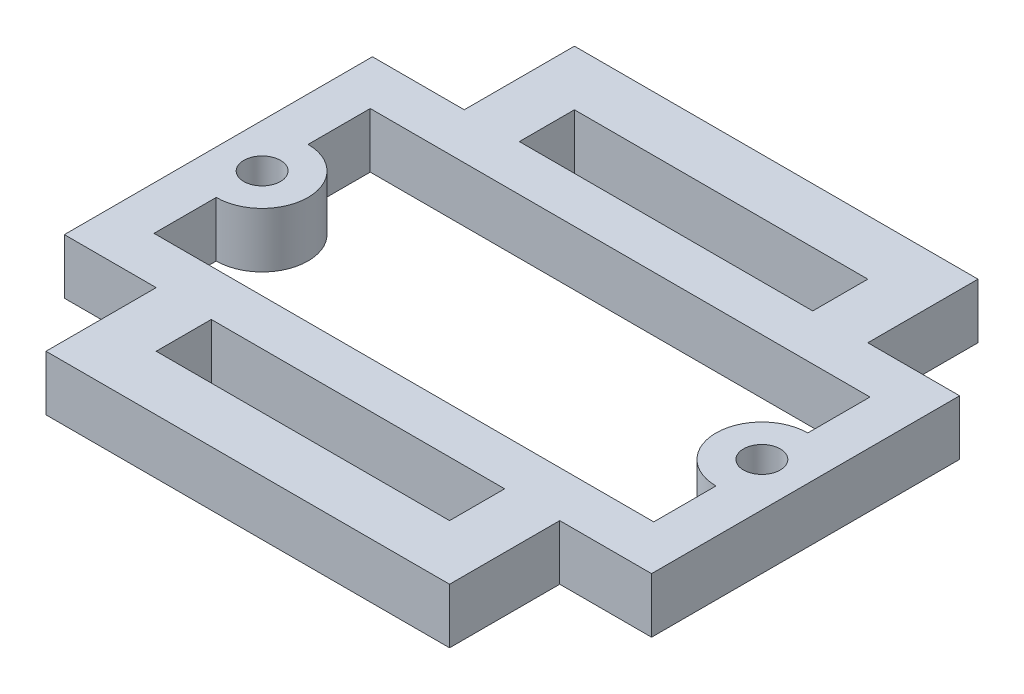
ISO-10303-21;
HEADER;
FILE_DESCRIPTION(('STEP AP214'),'2;1');
FILE_NAME('part.step','',(''),(''),'','','');
FILE_SCHEMA(('AUTOMOTIVE_DESIGN { 1 0 10303 214 1 1 1 1 }'));
ENDSEC;
DATA;
#1=APPLICATION_CONTEXT('core data for automotive mechanical design processes');
#2=APPLICATION_PROTOCOL_DEFINITION('international standard','automotive_design',2000,#1);
#3=PRODUCT_CONTEXT('',#1,'mechanical');
#4=PRODUCT('Part','Part','',(#3));
#5=PRODUCT_RELATED_PRODUCT_CATEGORY('part','',(#4));
#6=PRODUCT_DEFINITION_FORMATION('','',#4);
#7=PRODUCT_DEFINITION_CONTEXT('part definition',#1,'design');
#8=PRODUCT_DEFINITION('design','',#6,#7);
#9=PRODUCT_DEFINITION_SHAPE('','',#8);
#10=(LENGTH_UNIT() NAMED_UNIT(*) SI_UNIT(.MILLI.,.METRE.));
#11=(NAMED_UNIT(*) PLANE_ANGLE_UNIT() SI_UNIT($,.RADIAN.));
#12=(NAMED_UNIT(*) SI_UNIT($,.STERADIAN.) SOLID_ANGLE_UNIT());
#13=UNCERTAINTY_MEASURE_WITH_UNIT(LENGTH_MEASURE(1.E-05),#10,'distance_accuracy_value','');
#14=(GEOMETRIC_REPRESENTATION_CONTEXT(3) GLOBAL_UNCERTAINTY_ASSIGNED_CONTEXT((#13)) GLOBAL_UNIT_ASSIGNED_CONTEXT((#10,
#11,#12)) REPRESENTATION_CONTEXT('',''));
#15=CARTESIAN_POINT('',(0.,0.,0.));
#16=DIRECTION('',(0.,0.,1.));
#17=DIRECTION('',(1.,0.,0.));
#18=AXIS2_PLACEMENT_3D('',#15,#16,#17);
#19=CARTESIAN_POINT('',(30.06725,3.048,0.));
#20=DIRECTION('',(1.,0.,0.));
#21=DIRECTION('',(0.,0.,-1.));
#22=AXIS2_PLACEMENT_3D('',#19,#20,#21);
#23=PLANE('',#22);
#24=DIRECTION('',(0.,0.,1.));
#25=VECTOR('',#24,1.);
#26=CARTESIAN_POINT('',(30.06725,0.,0.));
#27=LINE('',#26,#25);
#28=CARTESIAN_POINT('',(30.06725,0.,2.54));
#29=VERTEX_POINT('',#28);
#30=CARTESIAN_POINT('',(30.06725,0.,5.98169999999999));
#31=VERTEX_POINT('',#30);
#32=EDGE_CURVE('E309',#29,#31,#27,.T.);
#33=ORIENTED_EDGE('',*,*,#32,.T.);
#34=DIRECTION('',(0.,-1.,0.));
#35=VECTOR('',#34,1.);
#36=CARTESIAN_POINT('',(30.06725,3.048,5.98169999999999));
#37=LINE('',#36,#35);
#38=CARTESIAN_POINT('',(30.06725,3.048,5.98169999999999));
#39=VERTEX_POINT('',#38);
#40=EDGE_CURVE('E11',#39,#31,#37,.T.);
#41=ORIENTED_EDGE('',*,*,#40,.F.);
#42=DIRECTION('',(0.,0.,1.));
#43=VECTOR('',#42,1.);
#44=CARTESIAN_POINT('',(30.06725,3.048,0.));
#45=LINE('',#44,#43);
#46=CARTESIAN_POINT('',(30.06725,3.048,2.54));
#47=VERTEX_POINT('',#46);
#48=EDGE_CURVE('E530',#47,#39,#45,.T.);
#49=ORIENTED_EDGE('',*,*,#48,.F.);
#50=DIRECTION('',(0.,-1.,0.));
#51=VECTOR('',#50,1.);
#52=CARTESIAN_POINT('',(30.06725,3.048,2.54));
#53=LINE('',#52,#51);
#54=EDGE_CURVE('E334',#47,#29,#53,.T.);
#55=ORIENTED_EDGE('',*,*,#54,.T.);
#56=EDGE_LOOP('',(#33,#41,#49,#55));
#57=FACE_BOUND('',#56,.T.);
#58=ADVANCED_FACE('F35',(#57),#23,.F.);
#59=CARTESIAN_POINT('',(0.,3.048,5.98169999999999));
#60=DIRECTION('',(0.,0.,-1.));
#61=DIRECTION('',(-1.,0.,0.));
#62=AXIS2_PLACEMENT_3D('',#59,#60,#61);
#63=PLANE('',#62);
#64=DIRECTION('',(1.,0.,0.));
#65=VECTOR('',#64,1.);
#66=CARTESIAN_POINT('',(0.,0.,5.98169999999999));
#67=LINE('',#66,#65);
#68=CARTESIAN_POINT('',(2.41935,0.,5.98169999999999));
#69=VERTEX_POINT('',#68);
#70=EDGE_CURVE('E312',#69,#31,#67,.T.);
#71=ORIENTED_EDGE('',*,*,#70,.F.);
#72=DIRECTION('',(0.,-1.,0.));
#73=VECTOR('',#72,1.);
#74=CARTESIAN_POINT('',(2.41935,3.048,5.98169999999999));
#75=LINE('',#74,#73);
#76=CARTESIAN_POINT('',(2.41935,3.048,5.98169999999999));
#77=VERTEX_POINT('',#76);
#78=EDGE_CURVE('E45',#77,#69,#75,.T.);
#79=ORIENTED_EDGE('',*,*,#78,.F.);
#80=DIRECTION('',(1.,0.,0.));
#81=VECTOR('',#80,1.);
#82=CARTESIAN_POINT('',(0.,3.048,5.98169999999999));
#83=LINE('',#82,#81);
#84=EDGE_CURVE('E525',#77,#39,#83,.T.);
#85=ORIENTED_EDGE('',*,*,#84,.T.);
#86=ORIENTED_EDGE('',*,*,#40,.T.);
#87=EDGE_LOOP('',(#71,#79,#85,#86));
#88=FACE_BOUND('',#87,.T.);
#89=ADVANCED_FACE('F418',(#88),#63,.T.);
#90=CARTESIAN_POINT('',(2.41935,3.048,0.));
#91=DIRECTION('',(1.,0.,0.));
#92=DIRECTION('',(0.,0.,-1.));
#93=AXIS2_PLACEMENT_3D('',#90,#91,#92);
#94=PLANE('',#93);
#95=DIRECTION('',(0.,0.,1.));
#96=VECTOR('',#95,1.);
#97=CARTESIAN_POINT('',(2.41935,0.,0.));
#98=LINE('',#97,#96);
#99=CARTESIAN_POINT('',(2.41935,0.,2.54));
#100=VERTEX_POINT('',#99);
#101=EDGE_CURVE('E315',#100,#69,#98,.T.);
#102=ORIENTED_EDGE('',*,*,#101,.F.);
#103=DIRECTION('',(0.,-1.,0.));
#104=VECTOR('',#103,1.);
#105=CARTESIAN_POINT('',(2.41935,3.048,2.54));
#106=LINE('',#105,#104);
#107=CARTESIAN_POINT('',(2.41935,3.048,2.54));
#108=VERTEX_POINT('',#107);
#109=EDGE_CURVE('E341',#108,#100,#106,.T.);
#110=ORIENTED_EDGE('',*,*,#109,.F.);
#111=DIRECTION('',(0.,0.,1.));
#112=VECTOR('',#111,1.);
#113=CARTESIAN_POINT('',(2.41935,3.048,0.));
#114=LINE('',#113,#112);
#115=EDGE_CURVE('E523',#108,#77,#114,.T.);
#116=ORIENTED_EDGE('',*,*,#115,.T.);
#117=ORIENTED_EDGE('',*,*,#78,.T.);
#118=EDGE_LOOP('',(#102,#110,#116,#117));
#119=FACE_BOUND('',#118,.T.);
#120=ADVANCED_FACE('F424',(#119),#94,.T.);
#121=CARTESIAN_POINT('',(2.41935,3.048,0.));
#122=DIRECTION('',(0.,-1.,0.));
#123=DIRECTION('',(0.,0.,-1.));
#124=AXIS2_PLACEMENT_3D('',#121,#122,#123);
#125=CYLINDRICAL_SURFACE('',#124,2.54);
#126=CARTESIAN_POINT('',(2.41935,0.,0.));
#127=DIRECTION('',(0.,1.,0.));
#128=DIRECTION('',(0.,0.,1.));
#129=AXIS2_PLACEMENT_3D('',#126,#127,#128);
#130=CIRCLE('',#129,2.54);
#131=CARTESIAN_POINT('',(2.41935,0.,-2.54));
#132=VERTEX_POINT('',#131);
#133=EDGE_CURVE('E318',#132,#100,#130,.F.);
#134=ORIENTED_EDGE('',*,*,#133,.F.);
#135=DIRECTION('',(0.,-1.,0.));
#136=VECTOR('',#135,1.);
#137=CARTESIAN_POINT('',(2.41935,3.048,-2.54));
#138=LINE('',#137,#136);
#139=CARTESIAN_POINT('',(2.41935,3.048,-2.54));
#140=VERTEX_POINT('',#139);
#141=EDGE_CURVE('E339',#140,#132,#138,.T.);
#142=ORIENTED_EDGE('',*,*,#141,.F.);
#143=CARTESIAN_POINT('',(2.41935,3.048,0.));
#144=DIRECTION('',(0.,1.,0.));
#145=DIRECTION('',(0.,0.,1.));
#146=AXIS2_PLACEMENT_3D('',#143,#144,#145);
#147=CIRCLE('',#146,2.54);
#148=EDGE_CURVE('E522',#140,#108,#147,.F.);
#149=ORIENTED_EDGE('',*,*,#148,.T.);
#150=ORIENTED_EDGE('',*,*,#109,.T.);
#151=EDGE_LOOP('',(#134,#142,#149,#150));
#152=FACE_BOUND('',#151,.T.);
#153=ADVANCED_FACE('F504',(#152),#125,.T.);
#154=CARTESIAN_POINT('',(2.41935,3.048,0.));
#155=DIRECTION('',(-1.,0.,0.));
#156=DIRECTION('',(0.,0.,1.));
#157=AXIS2_PLACEMENT_3D('',#154,#155,#156);
#158=PLANE('',#157);
#159=DIRECTION('',(0.,0.,-1.));
#160=VECTOR('',#159,1.);
#161=CARTESIAN_POINT('',(2.41935,0.,0.));
#162=LINE('',#161,#160);
#163=CARTESIAN_POINT('',(2.41935,0.,-5.98169999999999));
#164=VERTEX_POINT('',#163);
#165=EDGE_CURVE('E321',#132,#164,#162,.T.);
#166=ORIENTED_EDGE('',*,*,#165,.T.);
#167=DIRECTION('',(0.,-1.,0.));
#168=VECTOR('',#167,1.);
#169=CARTESIAN_POINT('',(2.41935,3.048,-5.98169999999999));
#170=LINE('',#169,#168);
#171=CARTESIAN_POINT('',(2.41935,3.048,-5.98169999999999));
#172=VERTEX_POINT('',#171);
#173=EDGE_CURVE('E246',#172,#164,#170,.T.);
#174=ORIENTED_EDGE('',*,*,#173,.F.);
#175=DIRECTION('',(0.,0.,-1.));
#176=VECTOR('',#175,1.);
#177=CARTESIAN_POINT('',(2.41935,3.048,0.));
#178=LINE('',#177,#176);
#179=EDGE_CURVE('E233',#140,#172,#178,.T.);
#180=ORIENTED_EDGE('',*,*,#179,.F.);
#181=ORIENTED_EDGE('',*,*,#141,.T.);
#182=EDGE_LOOP('',(#166,#174,#180,#181));
#183=FACE_BOUND('',#182,.T.);
#184=ADVANCED_FACE('F501',(#183),#158,.F.);
#185=CARTESIAN_POINT('',(0.,3.048,-5.98169999999999));
#186=DIRECTION('',(0.,0.,-1.));
#187=DIRECTION('',(-1.,0.,0.));
#188=AXIS2_PLACEMENT_3D('',#185,#186,#187);
#189=PLANE('',#188);
#190=DIRECTION('',(1.,0.,0.));
#191=VECTOR('',#190,1.);
#192=CARTESIAN_POINT('',(0.,0.,-5.98169999999999));
#193=LINE('',#192,#191);
#194=CARTESIAN_POINT('',(30.06725,0.,-5.98170000000001));
#195=VERTEX_POINT('',#194);
#196=EDGE_CURVE('E242',#164,#195,#193,.T.);
#197=ORIENTED_EDGE('',*,*,#196,.T.);
#198=DIRECTION('',(0.,-1.,0.));
#199=VECTOR('',#198,1.);
#200=CARTESIAN_POINT('',(30.06725,3.048,-5.98170000000001));
#201=LINE('',#200,#199);
#202=CARTESIAN_POINT('',(30.06725,3.048,-5.98170000000001));
#203=VERTEX_POINT('',#202);
#204=EDGE_CURVE('E239',#203,#195,#201,.T.);
#205=ORIENTED_EDGE('',*,*,#204,.F.);
#206=DIRECTION('',(1.,0.,0.));
#207=VECTOR('',#206,1.);
#208=CARTESIAN_POINT('',(0.,3.048,-5.98169999999999));
#209=LINE('',#208,#207);
#210=EDGE_CURVE('E225',#172,#203,#209,.T.);
#211=ORIENTED_EDGE('',*,*,#210,.F.);
#212=ORIENTED_EDGE('',*,*,#173,.T.);
#213=EDGE_LOOP('',(#197,#205,#211,#212));
#214=FACE_BOUND('',#213,.T.);
#215=ADVANCED_FACE('F240',(#214),#189,.F.);
#216=CARTESIAN_POINT('',(30.06725,3.048,0.));
#217=DIRECTION('',(-1.,0.,0.));
#218=DIRECTION('',(0.,0.,1.));
#219=AXIS2_PLACEMENT_3D('',#216,#217,#218);
#220=PLANE('',#219);
#221=DIRECTION('',(0.,0.,-1.));
#222=VECTOR('',#221,1.);
#223=CARTESIAN_POINT('',(30.06725,0.,0.));
#224=LINE('',#223,#222);
#225=CARTESIAN_POINT('',(30.06725,0.,-2.54));
#226=VERTEX_POINT('',#225);
#227=EDGE_CURVE('E324',#226,#195,#224,.T.);
#228=ORIENTED_EDGE('',*,*,#227,.F.);
#229=DIRECTION('',(0.,-1.,0.));
#230=VECTOR('',#229,1.);
#231=CARTESIAN_POINT('',(30.06725,3.048,-2.54));
#232=LINE('',#231,#230);
#233=CARTESIAN_POINT('',(30.06725,3.048,-2.54));
#234=VERTEX_POINT('',#233);
#235=EDGE_CURVE('E141',#234,#226,#232,.T.);
#236=ORIENTED_EDGE('',*,*,#235,.F.);
#237=DIRECTION('',(0.,0.,-1.));
#238=VECTOR('',#237,1.);
#239=CARTESIAN_POINT('',(30.06725,3.048,0.));
#240=LINE('',#239,#238);
#241=EDGE_CURVE('E230',#234,#203,#240,.T.);
#242=ORIENTED_EDGE('',*,*,#241,.T.);
#243=ORIENTED_EDGE('',*,*,#204,.T.);
#244=EDGE_LOOP('',(#228,#236,#242,#243));
#245=FACE_BOUND('',#244,.T.);
#246=ADVANCED_FACE('F248',(#245),#220,.T.);
#247=CARTESIAN_POINT('',(0.,3.048,-8.52169999999999));
#248=DIRECTION('',(0.,0.,-1.));
#249=DIRECTION('',(-1.,0.,0.));
#250=AXIS2_PLACEMENT_3D('',#247,#248,#249);
#251=PLANE('',#250);
#252=DIRECTION('',(1.,0.,0.));
#253=VECTOR('',#252,1.);
#254=CARTESIAN_POINT('',(0.,0.,-8.52169999999999));
#255=LINE('',#254,#253);
#256=CARTESIAN_POINT('',(8.128,0.,-8.52169999999999));
#257=VERTEX_POINT('',#256);
#258=CARTESIAN_POINT('',(24.3586,0.,-8.52169999999999));
#259=VERTEX_POINT('',#258);
#260=EDGE_CURVE('E281',#257,#259,#255,.T.);
#261=ORIENTED_EDGE('',*,*,#260,.F.);
#262=DIRECTION('',(0.,-1.,0.));
#263=VECTOR('',#262,1.);
#264=CARTESIAN_POINT('',(8.128,3.048,-8.52169999999999));
#265=LINE('',#264,#263);
#266=CARTESIAN_POINT('',(8.128,3.048,-8.52169999999999));
#267=VERTEX_POINT('',#266);
#268=EDGE_CURVE('E336',#267,#257,#265,.T.);
#269=ORIENTED_EDGE('',*,*,#268,.F.);
#270=DIRECTION('',(1.,0.,0.));
#271=VECTOR('',#270,1.);
#272=CARTESIAN_POINT('',(0.,3.048,-8.52169999999999));
#273=LINE('',#272,#271);
#274=CARTESIAN_POINT('',(24.3586,3.048,-8.52169999999999));
#275=VERTEX_POINT('',#274);
#276=EDGE_CURVE('E540',#267,#275,#273,.T.);
#277=ORIENTED_EDGE('',*,*,#276,.T.);
#278=DIRECTION('',(0.,-1.,0.));
#279=VECTOR('',#278,1.);
#280=CARTESIAN_POINT('',(24.3586,3.048,-8.52169999999999));
#281=LINE('',#280,#279);
#282=EDGE_CURVE('E344',#275,#259,#281,.T.);
#283=ORIENTED_EDGE('',*,*,#282,.T.);
#284=EDGE_LOOP('',(#261,#269,#277,#283));
#285=FACE_BOUND('',#284,.T.);
#286=ADVANCED_FACE('F441',(#285),#251,.T.);
#287=CARTESIAN_POINT('',(8.128,3.048,0.));
#288=DIRECTION('',(-1.,0.,0.));
#289=DIRECTION('',(0.,0.,1.));
#290=AXIS2_PLACEMENT_3D('',#287,#288,#289);
#291=PLANE('',#290);
#292=DIRECTION('',(0.,0.,-1.));
#293=VECTOR('',#292,1.);
#294=CARTESIAN_POINT('',(8.128,0.,0.));
#295=LINE('',#294,#293);
#296=CARTESIAN_POINT('',(8.128,0.,-11.5697));
#297=VERTEX_POINT('',#296);
#298=EDGE_CURVE('E300',#257,#297,#295,.T.);
#299=ORIENTED_EDGE('',*,*,#298,.T.);
#300=DIRECTION('',(0.,-1.,0.));
#301=VECTOR('',#300,1.);
#302=CARTESIAN_POINT('',(8.128,3.048,-11.5697));
#303=LINE('',#302,#301);
#304=CARTESIAN_POINT('',(8.128,3.048,-11.5697));
#305=VERTEX_POINT('',#304);
#306=EDGE_CURVE('E350',#305,#297,#303,.T.);
#307=ORIENTED_EDGE('',*,*,#306,.F.);
#308=DIRECTION('',(0.,0.,-1.));
#309=VECTOR('',#308,1.);
#310=CARTESIAN_POINT('',(8.128,3.048,0.));
#311=LINE('',#310,#309);
#312=EDGE_CURVE('E537',#267,#305,#311,.T.);
#313=ORIENTED_EDGE('',*,*,#312,.F.);
#314=ORIENTED_EDGE('',*,*,#268,.T.);
#315=EDGE_LOOP('',(#299,#307,#313,#314));
#316=FACE_BOUND('',#315,.T.);
#317=ADVANCED_FACE('F437',(#316),#291,.F.);
#318=CARTESIAN_POINT('',(0.,3.048,-11.5697));
#319=DIRECTION('',(0.,0.,-1.));
#320=DIRECTION('',(-1.,0.,0.));
#321=AXIS2_PLACEMENT_3D('',#318,#319,#320);
#322=PLANE('',#321);
#323=DIRECTION('',(1.,0.,0.));
#324=VECTOR('',#323,1.);
#325=CARTESIAN_POINT('',(0.,0.,-11.5697));
#326=LINE('',#325,#324);
#327=CARTESIAN_POINT('',(24.3586,0.,-11.5697));
#328=VERTEX_POINT('',#327);
#329=EDGE_CURVE('E303',#297,#328,#326,.T.);
#330=ORIENTED_EDGE('',*,*,#329,.T.);
#331=DIRECTION('',(0.,-1.,0.));
#332=VECTOR('',#331,1.);
#333=CARTESIAN_POINT('',(24.3586,3.048,-11.5697));
#334=LINE('',#333,#332);
#335=CARTESIAN_POINT('',(24.3586,3.048,-11.5697));
#336=VERTEX_POINT('',#335);
#337=EDGE_CURVE('E346',#336,#328,#334,.T.);
#338=ORIENTED_EDGE('',*,*,#337,.F.);
#339=DIRECTION('',(1.,0.,0.));
#340=VECTOR('',#339,1.);
#341=CARTESIAN_POINT('',(0.,3.048,-11.5697));
#342=LINE('',#341,#340);
#343=EDGE_CURVE('E534',#305,#336,#342,.T.);
#344=ORIENTED_EDGE('',*,*,#343,.F.);
#345=ORIENTED_EDGE('',*,*,#306,.T.);
#346=EDGE_LOOP('',(#330,#338,#344,#345));
#347=FACE_BOUND('',#346,.T.);
#348=ADVANCED_FACE('F434',(#347),#322,.F.);
#349=CARTESIAN_POINT('',(0.,3.048,8.52169999999999));
#350=DIRECTION('',(0.,0.,-1.));
#351=DIRECTION('',(-1.,0.,0.));
#352=AXIS2_PLACEMENT_3D('',#349,#350,#351);
#353=PLANE('',#352);
#354=DIRECTION('',(1.,0.,0.));
#355=VECTOR('',#354,1.);
#356=CARTESIAN_POINT('',(0.,0.,8.52169999999999));
#357=LINE('',#356,#355);
#358=CARTESIAN_POINT('',(27.4066,0.,8.52169999999999));
#359=VERTEX_POINT('',#358);
#360=CARTESIAN_POINT('',(32.4866,0.,8.52169999999999));
#361=VERTEX_POINT('',#360);
#362=EDGE_CURVE('E268',#359,#361,#357,.T.);
#363=ORIENTED_EDGE('',*,*,#362,.T.);
#364=DIRECTION('',(0.,-1.,0.));
#365=VECTOR('',#364,1.);
#366=CARTESIAN_POINT('',(32.4866,3.048,8.52169999999999));
#367=LINE('',#366,#365);
#368=CARTESIAN_POINT('',(32.4866,3.048,8.52169999999999));
#369=VERTEX_POINT('',#368);
#370=EDGE_CURVE('E347',#369,#361,#367,.T.);
#371=ORIENTED_EDGE('',*,*,#370,.F.);
#372=DIRECTION('',(1.,0.,0.));
#373=VECTOR('',#372,1.);
#374=CARTESIAN_POINT('',(0.,3.048,8.52169999999999));
#375=LINE('',#374,#373);
#376=CARTESIAN_POINT('',(27.4066,3.048,8.52169999999999));
#377=VERTEX_POINT('',#376);
#378=EDGE_CURVE('E567',#377,#369,#375,.T.);
#379=ORIENTED_EDGE('',*,*,#378,.F.);
#380=DIRECTION('',(0.,-1.,0.));
#381=VECTOR('',#380,1.);
#382=CARTESIAN_POINT('',(27.4066,3.048,8.52169999999999));
#383=LINE('',#382,#381);
#384=EDGE_CURVE('E354',#377,#359,#383,.T.);
#385=ORIENTED_EDGE('',*,*,#384,.T.);
#386=EDGE_LOOP('',(#363,#371,#379,#385));
#387=FACE_BOUND('',#386,.T.);
#388=ADVANCED_FACE('F414',(#387),#353,.F.);
#389=CARTESIAN_POINT('',(32.4866,3.048,0.));
#390=DIRECTION('',(1.,0.,0.));
#391=DIRECTION('',(0.,0.,-1.));
#392=AXIS2_PLACEMENT_3D('',#389,#390,#391);
#393=PLANE('',#392);
#394=DIRECTION('',(0.,0.,1.));
#395=VECTOR('',#394,1.);
#396=CARTESIAN_POINT('',(32.4866,0.,0.));
#397=LINE('',#396,#395);
#398=CARTESIAN_POINT('',(32.4866,0.,-8.52169999999999));
#399=VERTEX_POINT('',#398);
#400=EDGE_CURVE('E274',#399,#361,#397,.T.);
#401=ORIENTED_EDGE('',*,*,#400,.F.);
#402=DIRECTION('',(0.,-1.,0.));
#403=VECTOR('',#402,1.);
#404=CARTESIAN_POINT('',(32.4866,3.048,-8.52169999999999));
#405=LINE('',#404,#403);
#406=CARTESIAN_POINT('',(32.4866,3.048,-8.52169999999999));
#407=VERTEX_POINT('',#406);
#408=EDGE_CURVE('E378',#407,#399,#405,.T.);
#409=ORIENTED_EDGE('',*,*,#408,.F.);
#410=DIRECTION('',(0.,0.,1.));
#411=VECTOR('',#410,1.);
#412=CARTESIAN_POINT('',(32.4866,3.048,0.));
#413=LINE('',#412,#411);
#414=EDGE_CURVE('E564',#407,#369,#413,.T.);
#415=ORIENTED_EDGE('',*,*,#414,.T.);
#416=ORIENTED_EDGE('',*,*,#370,.T.);
#417=EDGE_LOOP('',(#401,#409,#415,#416));
#418=FACE_BOUND('',#417,.T.);
#419=ADVANCED_FACE('F477',(#418),#393,.T.);
#420=CARTESIAN_POINT('',(27.4066,0.,-8.52169999999999));
#421=VERTEX_POINT('',#420);
#422=EDGE_CURVE('E277',#421,#399,#255,.T.);
#423=ORIENTED_EDGE('',*,*,#422,.F.);
#424=DIRECTION('',(0.,-1.,0.));
#425=VECTOR('',#424,1.);
#426=CARTESIAN_POINT('',(27.4066,3.048,-8.52169999999999));
#427=LINE('',#426,#425);
#428=CARTESIAN_POINT('',(27.4066,3.048,-8.52169999999999));
#429=VERTEX_POINT('',#428);
#430=EDGE_CURVE('E376',#429,#421,#427,.T.);
#431=ORIENTED_EDGE('',*,*,#430,.F.);
#432=EDGE_CURVE('E561',#429,#407,#273,.T.);
#433=ORIENTED_EDGE('',*,*,#432,.T.);
#434=ORIENTED_EDGE('',*,*,#408,.T.);
#435=EDGE_LOOP('',(#423,#431,#433,#434));
#436=FACE_BOUND('',#435,.T.);
#437=ADVANCED_FACE('F446',(#436),#251,.T.);
#438=CARTESIAN_POINT('',(27.4066,3.048,0.));
#439=DIRECTION('',(1.,0.,0.));
#440=DIRECTION('',(0.,0.,-1.));
#441=AXIS2_PLACEMENT_3D('',#438,#439,#440);
#442=PLANE('',#441);
#443=DIRECTION('',(0.,0.,1.));
#444=VECTOR('',#443,1.);
#445=CARTESIAN_POINT('',(27.4066,0.,0.));
#446=LINE('',#445,#444);
#447=CARTESIAN_POINT('',(27.4066,0.,-14.6177));
#448=VERTEX_POINT('',#447);
#449=EDGE_CURVE('E280',#448,#421,#446,.T.);
#450=ORIENTED_EDGE('',*,*,#449,.F.);
#451=DIRECTION('',(0.,-1.,0.));
#452=VECTOR('',#451,1.);
#453=CARTESIAN_POINT('',(27.4066,3.048,-14.6177));
#454=LINE('',#453,#452);
#455=CARTESIAN_POINT('',(27.4066,3.048,-14.6177));
#456=VERTEX_POINT('',#455);
#457=EDGE_CURVE('E374',#456,#448,#454,.T.);
#458=ORIENTED_EDGE('',*,*,#457,.F.);
#459=DIRECTION('',(0.,0.,1.));
#460=VECTOR('',#459,1.);
#461=CARTESIAN_POINT('',(27.4066,3.048,0.));
#462=LINE('',#461,#460);
#463=EDGE_CURVE('E558',#456,#429,#462,.T.);
#464=ORIENTED_EDGE('',*,*,#463,.T.);
#465=ORIENTED_EDGE('',*,*,#430,.T.);
#466=EDGE_LOOP('',(#450,#458,#464,#465));
#467=FACE_BOUND('',#466,.T.);
#468=ADVANCED_FACE('F472',(#467),#442,.T.);
#469=CARTESIAN_POINT('',(0.,3.048,-14.6177));
#470=DIRECTION('',(0.,0.,-1.));
#471=DIRECTION('',(-1.,0.,0.));
#472=AXIS2_PLACEMENT_3D('',#469,#470,#471);
#473=PLANE('',#472);
#474=DIRECTION('',(1.,0.,0.));
#475=VECTOR('',#474,1.);
#476=CARTESIAN_POINT('',(0.,0.,-14.6177));
#477=LINE('',#476,#475);
#478=CARTESIAN_POINT('',(5.08,0.,-14.6177));
#479=VERTEX_POINT('',#478);
#480=EDGE_CURVE('E285',#479,#448,#477,.T.);
#481=ORIENTED_EDGE('',*,*,#480,.F.);
#482=DIRECTION('',(0.,-1.,0.));
#483=VECTOR('',#482,1.);
#484=CARTESIAN_POINT('',(5.08,3.048,-14.6177));
#485=LINE('',#484,#483);
#486=CARTESIAN_POINT('',(5.08,3.048,-14.6177));
#487=VERTEX_POINT('',#486);
#488=EDGE_CURVE('E372',#487,#479,#485,.T.);
#489=ORIENTED_EDGE('',*,*,#488,.F.);
#490=DIRECTION('',(1.,0.,0.));
#491=VECTOR('',#490,1.);
#492=CARTESIAN_POINT('',(0.,3.048,-14.6177));
#493=LINE('',#492,#491);
#494=EDGE_CURVE('E555',#487,#456,#493,.T.);
#495=ORIENTED_EDGE('',*,*,#494,.T.);
#496=ORIENTED_EDGE('',*,*,#457,.T.);
#497=EDGE_LOOP('',(#481,#489,#495,#496));
#498=FACE_BOUND('',#497,.T.);
#499=ADVANCED_FACE('F468',(#498),#473,.T.);
#500=CARTESIAN_POINT('',(5.08,3.048,0.));
#501=DIRECTION('',(-1.,0.,0.));
#502=DIRECTION('',(0.,0.,1.));
#503=AXIS2_PLACEMENT_3D('',#500,#501,#502);
#504=PLANE('',#503);
#505=DIRECTION('',(0.,0.,-1.));
#506=VECTOR('',#505,1.);
#507=CARTESIAN_POINT('',(5.08,0.,0.));
#508=LINE('',#507,#506);
#509=CARTESIAN_POINT('',(5.08,0.,-8.52169999999999));
#510=VERTEX_POINT('',#509);
#511=EDGE_CURVE('E288',#510,#479,#508,.T.);
#512=ORIENTED_EDGE('',*,*,#511,.F.);
#513=DIRECTION('',(0.,-1.,0.));
#514=VECTOR('',#513,1.);
#515=CARTESIAN_POINT('',(5.08,3.048,-8.52169999999999));
#516=LINE('',#515,#514);
#517=CARTESIAN_POINT('',(5.08,3.048,-8.52169999999999));
#518=VERTEX_POINT('',#517);
#519=EDGE_CURVE('E370',#518,#510,#516,.T.);
#520=ORIENTED_EDGE('',*,*,#519,.F.);
#521=DIRECTION('',(0.,0.,-1.));
#522=VECTOR('',#521,1.);
#523=CARTESIAN_POINT('',(5.08,3.048,0.));
#524=LINE('',#523,#522);
#525=EDGE_CURVE('E552',#518,#487,#524,.T.);
#526=ORIENTED_EDGE('',*,*,#525,.T.);
#527=ORIENTED_EDGE('',*,*,#488,.T.);
#528=EDGE_LOOP('',(#512,#520,#526,#527));
#529=FACE_BOUND('',#528,.T.);
#530=ADVANCED_FACE('F465',(#529),#504,.T.);
#531=CARTESIAN_POINT('',(0.,0.,-8.52169999999999));
#532=VERTEX_POINT('',#531);
#533=EDGE_CURVE('E282',#532,#510,#255,.T.);
#534=ORIENTED_EDGE('',*,*,#533,.F.);
#535=DIRECTION('',(0.,-1.,0.));
#536=VECTOR('',#535,1.);
#537=CARTESIAN_POINT('',(0.,3.048,-8.52169999999999));
#538=LINE('',#537,#536);
#539=CARTESIAN_POINT('',(0.,3.048,-8.52169999999999));
#540=VERTEX_POINT('',#539);
#541=EDGE_CURVE('E368',#540,#532,#538,.T.);
#542=ORIENTED_EDGE('',*,*,#541,.F.);
#543=EDGE_CURVE('E551',#540,#518,#273,.T.);
#544=ORIENTED_EDGE('',*,*,#543,.T.);
#545=ORIENTED_EDGE('',*,*,#519,.T.);
#546=EDGE_LOOP('',(#534,#542,#544,#545));
#547=FACE_BOUND('',#546,.T.);
#548=ADVANCED_FACE('F447',(#547),#251,.T.);
#549=CARTESIAN_POINT('',(0.,3.048,0.));
#550=DIRECTION('',(-1.,0.,0.));
#551=DIRECTION('',(0.,0.,1.));
#552=AXIS2_PLACEMENT_3D('',#549,#550,#551);
#553=PLANE('',#552);
#554=DIRECTION('',(0.,0.,-1.));
#555=VECTOR('',#554,1.);
#556=CARTESIAN_POINT('',(0.,0.,0.));
#557=LINE('',#556,#555);
#558=CARTESIAN_POINT('',(0.,0.,8.52169999999999));
#559=VERTEX_POINT('',#558);
#560=EDGE_CURVE('E291',#559,#532,#557,.T.);
#561=ORIENTED_EDGE('',*,*,#560,.F.);
#562=DIRECTION('',(0.,-1.,0.));
#563=VECTOR('',#562,1.);
#564=CARTESIAN_POINT('',(0.,3.048,8.52169999999999));
#565=LINE('',#564,#563);
#566=CARTESIAN_POINT('',(0.,3.048,8.52169999999999));
#567=VERTEX_POINT('',#566);
#568=EDGE_CURVE('E366',#567,#559,#565,.T.);
#569=ORIENTED_EDGE('',*,*,#568,.F.);
#570=DIRECTION('',(0.,0.,-1.));
#571=VECTOR('',#570,1.);
#572=CARTESIAN_POINT('',(0.,3.048,0.));
#573=LINE('',#572,#571);
#574=EDGE_CURVE('E548',#567,#540,#573,.T.);
#575=ORIENTED_EDGE('',*,*,#574,.T.);
#576=ORIENTED_EDGE('',*,*,#541,.T.);
#577=EDGE_LOOP('',(#561,#569,#575,#576));
#578=FACE_BOUND('',#577,.T.);
#579=ADVANCED_FACE('F460',(#578),#553,.T.);
#580=CARTESIAN_POINT('',(5.08,0.,8.52169999999999));
#581=VERTEX_POINT('',#580);
#582=EDGE_CURVE('E267',#559,#581,#357,.T.);
#583=ORIENTED_EDGE('',*,*,#582,.T.);
#584=DIRECTION('',(0.,-1.,0.));
#585=VECTOR('',#584,1.);
#586=CARTESIAN_POINT('',(5.08,3.048,8.52169999999999));
#587=LINE('',#586,#585);
#588=CARTESIAN_POINT('',(5.08,3.048,8.52169999999999));
#589=VERTEX_POINT('',#588);
#590=EDGE_CURVE('E363',#589,#581,#587,.T.);
#591=ORIENTED_EDGE('',*,*,#590,.F.);
#592=EDGE_CURVE('E547',#567,#589,#375,.T.);
#593=ORIENTED_EDGE('',*,*,#592,.F.);
#594=ORIENTED_EDGE('',*,*,#568,.T.);
#595=EDGE_LOOP('',(#583,#591,#593,#594));
#596=FACE_BOUND('',#595,.T.);
#597=ADVANCED_FACE('F415',(#596),#353,.F.);
#598=CARTESIAN_POINT('',(5.08,3.048,0.));
#599=DIRECTION('',(1.,0.,0.));
#600=DIRECTION('',(0.,0.,-1.));
#601=AXIS2_PLACEMENT_3D('',#598,#599,#600);
#602=PLANE('',#601);
#603=DIRECTION('',(0.,0.,1.));
#604=VECTOR('',#603,1.);
#605=CARTESIAN_POINT('',(5.08,0.,0.));
#606=LINE('',#605,#604);
#607=CARTESIAN_POINT('',(5.08,0.,14.6177));
#608=VERTEX_POINT('',#607);
#609=EDGE_CURVE('E294',#581,#608,#606,.T.);
#610=ORIENTED_EDGE('',*,*,#609,.T.);
#611=DIRECTION('',(0.,-1.,0.));
#612=VECTOR('',#611,1.);
#613=CARTESIAN_POINT('',(5.08,3.048,14.6177));
#614=LINE('',#613,#612);
#615=CARTESIAN_POINT('',(5.08,3.048,14.6177));
#616=VERTEX_POINT('',#615);
#617=EDGE_CURVE('E360',#616,#608,#614,.T.);
#618=ORIENTED_EDGE('',*,*,#617,.F.);
#619=DIRECTION('',(0.,0.,1.));
#620=VECTOR('',#619,1.);
#621=CARTESIAN_POINT('',(5.08,3.048,0.));
#622=LINE('',#621,#620);
#623=EDGE_CURVE('E545',#589,#616,#622,.T.);
#624=ORIENTED_EDGE('',*,*,#623,.F.);
#625=ORIENTED_EDGE('',*,*,#590,.T.);
#626=EDGE_LOOP('',(#610,#618,#624,#625));
#627=FACE_BOUND('',#626,.T.);
#628=ADVANCED_FACE('F454',(#627),#602,.F.);
#629=CARTESIAN_POINT('',(0.,3.048,14.6177));
#630=DIRECTION('',(0.,0.,-1.));
#631=DIRECTION('',(-1.,0.,0.));
#632=AXIS2_PLACEMENT_3D('',#629,#630,#631);
#633=PLANE('',#632);
#634=DIRECTION('',(1.,0.,0.));
#635=VECTOR('',#634,1.);
#636=CARTESIAN_POINT('',(0.,0.,14.6177));
#637=LINE('',#636,#635);
#638=CARTESIAN_POINT('',(27.4066,0.,14.6177));
#639=VERTEX_POINT('',#638);
#640=EDGE_CURVE('E296',#608,#639,#637,.T.);
#641=ORIENTED_EDGE('',*,*,#640,.T.);
#642=DIRECTION('',(0.,-1.,0.));
#643=VECTOR('',#642,1.);
#644=CARTESIAN_POINT('',(27.4066,3.048,14.6177));
#645=LINE('',#644,#643);
#646=CARTESIAN_POINT('',(27.4066,3.048,14.6177));
#647=VERTEX_POINT('',#646);
#648=EDGE_CURVE('E357',#647,#639,#645,.T.);
#649=ORIENTED_EDGE('',*,*,#648,.F.);
#650=DIRECTION('',(1.,0.,0.));
#651=VECTOR('',#650,1.);
#652=CARTESIAN_POINT('',(0.,3.048,14.6177));
#653=LINE('',#652,#651);
#654=EDGE_CURVE('E543',#616,#647,#653,.T.);
#655=ORIENTED_EDGE('',*,*,#654,.F.);
#656=ORIENTED_EDGE('',*,*,#617,.T.);
#657=EDGE_LOOP('',(#641,#649,#655,#656));
#658=FACE_BOUND('',#657,.T.);
#659=ADVANCED_FACE('F451',(#658),#633,.F.);
#660=CARTESIAN_POINT('',(8.128,3.048,0.));
#661=DIRECTION('',(1.,0.,0.));
#662=DIRECTION('',(0.,0.,-1.));
#663=AXIS2_PLACEMENT_3D('',#660,#661,#662);
#664=PLANE('',#663);
#665=DIRECTION('',(0.,0.,1.));
#666=VECTOR('',#665,1.);
#667=CARTESIAN_POINT('',(8.128,0.,0.));
#668=LINE('',#667,#666);
#669=CARTESIAN_POINT('',(8.128,0.,8.52169999999999));
#670=VERTEX_POINT('',#669);
#671=CARTESIAN_POINT('',(8.128,0.,11.5697));
#672=VERTEX_POINT('',#671);
#673=EDGE_CURVE('E260',#670,#672,#668,.T.);
#674=ORIENTED_EDGE('',*,*,#673,.F.);
#675=DIRECTION('',(0.,-1.,0.));
#676=VECTOR('',#675,1.);
#677=CARTESIAN_POINT('',(8.128,3.048,8.52169999999999));
#678=LINE('',#677,#676);
#679=CARTESIAN_POINT('',(8.128,3.048,8.52169999999999));
#680=VERTEX_POINT('',#679);
#681=EDGE_CURVE('E39',#680,#670,#678,.T.);
#682=ORIENTED_EDGE('',*,*,#681,.F.);
#683=DIRECTION('',(0.,0.,1.));
#684=VECTOR('',#683,1.);
#685=CARTESIAN_POINT('',(8.128,3.048,0.));
#686=LINE('',#685,#684);
#687=CARTESIAN_POINT('',(8.128,3.048,11.5697));
#688=VERTEX_POINT('',#687);
#689=EDGE_CURVE('E333',#680,#688,#686,.T.);
#690=ORIENTED_EDGE('',*,*,#689,.T.);
#691=DIRECTION('',(0.,-1.,0.));
#692=VECTOR('',#691,1.);
#693=CARTESIAN_POINT('',(8.128,3.048,11.5697));
#694=LINE('',#693,#692);
#695=EDGE_CURVE('E259',#688,#672,#694,.T.);
#696=ORIENTED_EDGE('',*,*,#695,.T.);
#697=EDGE_LOOP('',(#674,#682,#690,#696));
#698=FACE_BOUND('',#697,.T.);
#699=ADVANCED_FACE('F37',(#698),#664,.T.);
#700=CARTESIAN_POINT('',(24.3586,0.,8.52169999999999));
#701=VERTEX_POINT('',#700);
#702=EDGE_CURVE('E263',#670,#701,#357,.T.);
#703=ORIENTED_EDGE('',*,*,#702,.T.);
#704=DIRECTION('',(0.,-1.,0.));
#705=VECTOR('',#704,1.);
#706=CARTESIAN_POINT('',(24.3586,3.048,8.52169999999999));
#707=LINE('',#706,#705);
#708=CARTESIAN_POINT('',(24.3586,3.048,8.52169999999999));
#709=VERTEX_POINT('',#708);
#710=EDGE_CURVE('E383',#709,#701,#707,.T.);
#711=ORIENTED_EDGE('',*,*,#710,.F.);
#712=EDGE_CURVE('E391',#680,#709,#375,.T.);
#713=ORIENTED_EDGE('',*,*,#712,.F.);
#714=ORIENTED_EDGE('',*,*,#681,.T.);
#715=EDGE_LOOP('',(#703,#711,#713,#714));
#716=FACE_BOUND('',#715,.T.);
#717=ADVANCED_FACE('F390',(#716),#353,.F.);
#718=CARTESIAN_POINT('',(24.3586,3.048,0.));
#719=DIRECTION('',(-1.,0.,0.));
#720=DIRECTION('',(0.,0.,1.));
#721=AXIS2_PLACEMENT_3D('',#718,#719,#720);
#722=PLANE('',#721);
#723=DIRECTION('',(0.,0.,-1.));
#724=VECTOR('',#723,1.);
#725=CARTESIAN_POINT('',(24.3586,0.,0.));
#726=LINE('',#725,#724);
#727=CARTESIAN_POINT('',(24.3586,0.,11.5697));
#728=VERTEX_POINT('',#727);
#729=EDGE_CURVE('E266',#728,#701,#726,.T.);
#730=ORIENTED_EDGE('',*,*,#729,.F.);
#731=DIRECTION('',(0.,-1.,0.));
#732=VECTOR('',#731,1.);
#733=CARTESIAN_POINT('',(24.3586,3.048,11.5697));
#734=LINE('',#733,#732);
#735=CARTESIAN_POINT('',(24.3586,3.048,11.5697));
#736=VERTEX_POINT('',#735);
#737=EDGE_CURVE('E382',#736,#728,#734,.T.);
#738=ORIENTED_EDGE('',*,*,#737,.F.);
#739=DIRECTION('',(0.,0.,-1.));
#740=VECTOR('',#739,1.);
#741=CARTESIAN_POINT('',(24.3586,3.048,0.));
#742=LINE('',#741,#740);
#743=EDGE_CURVE('E569',#736,#709,#742,.T.);
#744=ORIENTED_EDGE('',*,*,#743,.T.);
#745=ORIENTED_EDGE('',*,*,#710,.T.);
#746=EDGE_LOOP('',(#730,#738,#744,#745));
#747=FACE_BOUND('',#746,.T.);
#748=ADVANCED_FACE('F403',(#747),#722,.T.);
#749=CARTESIAN_POINT('',(30.06725,3.048,0.));
#750=DIRECTION('',(0.,-1.,0.));
#751=DIRECTION('',(0.,0.,-1.));
#752=AXIS2_PLACEMENT_3D('',#749,#750,#751);
#753=CYLINDRICAL_SURFACE('',#752,1.016);
#754=CARTESIAN_POINT('',(30.06725,3.048,0.));
#755=DIRECTION('',(0.,1.,0.));
#756=DIRECTION('',(0.,0.,1.));
#757=AXIS2_PLACEMENT_3D('',#754,#755,#756);
#758=CIRCLE('',#757,1.016);
#759=CARTESIAN_POINT('',(30.06725,3.048,-1.016));
#760=VERTEX_POINT('',#759);
#761=EDGE_CURVE('E250',#760,#760,#758,.T.);
#762=CARTESIAN_POINT('',(30.06725,0.,0.));
#763=DIRECTION('',(0.,1.,0.));
#764=DIRECTION('',(0.,0.,1.));
#765=AXIS2_PLACEMENT_3D('',#762,#763,#764);
#766=CIRCLE('',#765,1.016);
#767=CARTESIAN_POINT('',(30.06725,0.,-1.016));
#768=VERTEX_POINT('',#767);
#769=EDGE_CURVE('E327',#768,#768,#766,.T.);
#770=CARTESIAN_POINT('',(30.06725,3.048,-1.016));
#771=CARTESIAN_POINT('',(30.06725,3.01625,-1.016));
#772=CARTESIAN_POINT('',(30.06725,2.9845,-1.016));
#773=CARTESIAN_POINT('',(30.06725,2.921,-1.016));
#774=CARTESIAN_POINT('',(30.06725,2.88925,-1.016));
#775=CARTESIAN_POINT('',(30.06725,2.82575,-1.016));
#776=CARTESIAN_POINT('',(30.06725,2.794,-1.016));
#777=CARTESIAN_POINT('',(30.06725,2.7305,-1.016));
#778=CARTESIAN_POINT('',(30.06725,2.69875,-1.016));
#779=CARTESIAN_POINT('',(30.06725,2.63525,-1.016));
#780=CARTESIAN_POINT('',(30.06725,2.6035,-1.016));
#781=CARTESIAN_POINT('',(30.06725,2.54,-1.016));
#782=CARTESIAN_POINT('',(30.06725,2.50825,-1.016));
#783=CARTESIAN_POINT('',(30.06725,2.44475,-1.016));
#784=CARTESIAN_POINT('',(30.06725,2.413,-1.016));
#785=CARTESIAN_POINT('',(30.06725,2.3495,-1.016));
#786=CARTESIAN_POINT('',(30.06725,2.31775,-1.016));
#787=CARTESIAN_POINT('',(30.06725,2.25425,-1.016));
#788=CARTESIAN_POINT('',(30.06725,2.2225,-1.016));
#789=CARTESIAN_POINT('',(30.06725,2.159,-1.016));
#790=CARTESIAN_POINT('',(30.06725,2.12725,-1.016));
#791=CARTESIAN_POINT('',(30.06725,2.06375,-1.016));
#792=CARTESIAN_POINT('',(30.06725,2.032,-1.016));
#793=CARTESIAN_POINT('',(30.06725,1.9685,-1.016));
#794=CARTESIAN_POINT('',(30.06725,1.93675,-1.016));
#795=CARTESIAN_POINT('',(30.06725,1.87325,-1.016));
#796=CARTESIAN_POINT('',(30.06725,1.8415,-1.016));
#797=CARTESIAN_POINT('',(30.06725,1.778,-1.016));
#798=CARTESIAN_POINT('',(30.06725,1.74625,-1.016));
#799=CARTESIAN_POINT('',(30.06725,1.68275,-1.016));
#800=CARTESIAN_POINT('',(30.06725,1.651,-1.016));
#801=CARTESIAN_POINT('',(30.06725,1.5875,-1.016));
#802=CARTESIAN_POINT('',(30.06725,1.55575,-1.016));
#803=CARTESIAN_POINT('',(30.06725,1.49225,-1.016));
#804=CARTESIAN_POINT('',(30.06725,1.4605,-1.016));
#805=CARTESIAN_POINT('',(30.06725,1.397,-1.016));
#806=CARTESIAN_POINT('',(30.06725,1.36525,-1.016));
#807=CARTESIAN_POINT('',(30.06725,1.30175,-1.016));
#808=CARTESIAN_POINT('',(30.06725,1.27,-1.016));
#809=CARTESIAN_POINT('',(30.06725,1.2065,-1.016));
#810=CARTESIAN_POINT('',(30.06725,1.17475,-1.016));
#811=CARTESIAN_POINT('',(30.06725,1.11125,-1.016));
#812=CARTESIAN_POINT('',(30.06725,1.0795,-1.016));
#813=CARTESIAN_POINT('',(30.06725,1.016,-1.016));
#814=CARTESIAN_POINT('',(30.06725,0.98425,-1.016));
#815=CARTESIAN_POINT('',(30.06725,0.92075,-1.016));
#816=CARTESIAN_POINT('',(30.06725,0.889,-1.016));
#817=CARTESIAN_POINT('',(30.06725,0.8255,-1.016));
#818=CARTESIAN_POINT('',(30.06725,0.79375,-1.016));
#819=CARTESIAN_POINT('',(30.06725,0.73025,-1.016));
#820=CARTESIAN_POINT('',(30.06725,0.6985,-1.016));
#821=CARTESIAN_POINT('',(30.06725,0.635,-1.016));
#822=CARTESIAN_POINT('',(30.06725,0.60325,-1.016));
#823=CARTESIAN_POINT('',(30.06725,0.53975,-1.016));
#824=CARTESIAN_POINT('',(30.06725,0.508,-1.016));
#825=CARTESIAN_POINT('',(30.06725,0.4445,-1.016));
#826=CARTESIAN_POINT('',(30.06725,0.41275,-1.016));
#827=CARTESIAN_POINT('',(30.06725,0.34925,-1.016));
#828=CARTESIAN_POINT('',(30.06725,0.3175,-1.016));
#829=CARTESIAN_POINT('',(30.06725,0.254,-1.016));
#830=CARTESIAN_POINT('',(30.06725,0.22225,-1.016));
#831=CARTESIAN_POINT('',(30.06725,0.15875,-1.016));
#832=CARTESIAN_POINT('',(30.06725,0.127,-1.016));
#833=CARTESIAN_POINT('',(30.06725,0.0634999999999999,-1.016));
#834=CARTESIAN_POINT('',(30.06725,0.03175,-1.016));
#835=CARTESIAN_POINT('',(30.06725,0.,-1.016));
#836=B_SPLINE_CURVE_WITH_KNOTS('',3,(#770,#771,#772,#773,#774,#775,#776,#777,#778,#779,#780,
#781,#782,#783,#784,#785,#786,#787,#788,#789,#790,#791,#792,#793,#794,#795,#796,#797,#798,#799,
#800,#801,#802,#803,#804,#805,#806,#807,#808,#809,#810,#811,#812,#813,#814,#815,#816,#817,#818,
#819,#820,#821,#822,#823,#824,#825,#826,#827,#828,#829,#830,#831,#832,#833,#834,#835),
.UNSPECIFIED.,.F.,.F.,(4,2,2,2,2,2,2,2,2,2,2,2,2,2,2,2,2,2,2,2,2,2,2,2,2,2,2,2,2,2,2,2,4),(0.,
0.0952500000000003,0.1905,0.28575,0.381,0.47625,0.5715,0.66675,0.762,0.85725,0.9525,1.04775,
1.143,1.23825,1.3335,1.42875,1.524,1.61925,1.7145,1.80975,1.905,2.00025,2.0955,2.19075,2.286,
2.38125,2.4765,2.57175,2.667,2.76225,2.8575,2.95275,3.048),.UNSPECIFIED.);
#837=EDGE_CURVE('BSEAM405',#760,#768,#836,.T.);
#838=ORIENTED_EDGE('',*,*,#761,.T.);
#839=ORIENTED_EDGE('',*,*,#769,.F.);
#840=ORIENTED_EDGE('',*,*,#837,.T.);
#841=ORIENTED_EDGE('',*,*,#837,.F.);
#842=EDGE_LOOP('',(#838,#840,#839,#841));
#843=FACE_BOUND('',#842,.T.);
#844=ADVANCED_FACE('F405',(#843),#753,.F.);
#845=CARTESIAN_POINT('',(30.06725,3.048,0.));
#846=DIRECTION('',(0.,-1.,0.));
#847=DIRECTION('',(0.,0.,-1.));
#848=AXIS2_PLACEMENT_3D('',#845,#846,#847);
#849=CYLINDRICAL_SURFACE('',#848,2.54);
#850=CARTESIAN_POINT('',(30.06725,0.,0.));
#851=DIRECTION('',(0.,1.,0.));
#852=DIRECTION('',(0.,0.,1.));
#853=AXIS2_PLACEMENT_3D('',#850,#851,#852);
#854=CIRCLE('',#853,2.54);
#855=EDGE_CURVE('E144',#226,#29,#854,.T.);
#856=ORIENTED_EDGE('',*,*,#855,.T.);
#857=ORIENTED_EDGE('',*,*,#54,.F.);
#858=CARTESIAN_POINT('',(30.06725,3.048,0.));
#859=DIRECTION('',(0.,1.,0.));
#860=DIRECTION('',(0.,0.,1.));
#861=AXIS2_PLACEMENT_3D('',#858,#859,#860);
#862=CIRCLE('',#861,2.54);
#863=EDGE_CURVE('E54',#234,#47,#862,.T.);
#864=ORIENTED_EDGE('',*,*,#863,.F.);
#865=ORIENTED_EDGE('',*,*,#235,.T.);
#866=EDGE_LOOP('',(#856,#857,#864,#865));
#867=FACE_BOUND('',#866,.T.);
#868=ADVANCED_FACE('F410',(#867),#849,.T.);
#869=CARTESIAN_POINT('',(24.3586,3.048,0.));
#870=DIRECTION('',(1.,0.,0.));
#871=DIRECTION('',(0.,0.,-1.));
#872=AXIS2_PLACEMENT_3D('',#869,#870,#871);
#873=PLANE('',#872);
#874=DIRECTION('',(0.,0.,1.));
#875=VECTOR('',#874,1.);
#876=CARTESIAN_POINT('',(24.3586,0.,0.));
#877=LINE('',#876,#875);
#878=EDGE_CURVE('E306',#328,#259,#877,.T.);
#879=ORIENTED_EDGE('',*,*,#878,.T.);
#880=ORIENTED_EDGE('',*,*,#282,.F.);
#881=DIRECTION('',(0.,0.,1.));
#882=VECTOR('',#881,1.);
#883=CARTESIAN_POINT('',(24.3586,3.048,0.));
#884=LINE('',#883,#882);
#885=EDGE_CURVE('E532',#336,#275,#884,.T.);
#886=ORIENTED_EDGE('',*,*,#885,.F.);
#887=ORIENTED_EDGE('',*,*,#337,.T.);
#888=EDGE_LOOP('',(#879,#880,#886,#887));
#889=FACE_BOUND('',#888,.T.);
#890=ADVANCED_FACE('F429',(#889),#873,.F.);
#891=CARTESIAN_POINT('',(27.4066,3.048,0.));
#892=DIRECTION('',(-1.,0.,0.));
#893=DIRECTION('',(0.,0.,1.));
#894=AXIS2_PLACEMENT_3D('',#891,#892,#893);
#895=PLANE('',#894);
#896=DIRECTION('',(0.,0.,-1.));
#897=VECTOR('',#896,1.);
#898=CARTESIAN_POINT('',(27.4066,0.,0.));
#899=LINE('',#898,#897);
#900=EDGE_CURVE('E298',#639,#359,#899,.T.);
#901=ORIENTED_EDGE('',*,*,#900,.T.);
#902=ORIENTED_EDGE('',*,*,#384,.F.);
#903=DIRECTION('',(0.,0.,-1.));
#904=VECTOR('',#903,1.);
#905=CARTESIAN_POINT('',(27.4066,3.048,0.));
#906=LINE('',#905,#904);
#907=EDGE_CURVE('E541',#647,#377,#906,.T.);
#908=ORIENTED_EDGE('',*,*,#907,.F.);
#909=ORIENTED_EDGE('',*,*,#648,.T.);
#910=EDGE_LOOP('',(#901,#902,#908,#909));
#911=FACE_BOUND('',#910,.T.);
#912=ADVANCED_FACE('F432',(#911),#895,.F.);
#913=CARTESIAN_POINT('',(0.,3.048,11.5697));
#914=DIRECTION('',(0.,0.,-1.));
#915=DIRECTION('',(-1.,0.,0.));
#916=AXIS2_PLACEMENT_3D('',#913,#914,#915);
#917=PLANE('',#916);
#918=DIRECTION('',(1.,0.,0.));
#919=VECTOR('',#918,1.);
#920=CARTESIAN_POINT('',(0.,0.,11.5697));
#921=LINE('',#920,#919);
#922=EDGE_CURVE('E271',#672,#728,#921,.T.);
#923=ORIENTED_EDGE('',*,*,#922,.F.);
#924=ORIENTED_EDGE('',*,*,#695,.F.);
#925=DIRECTION('',(1.,0.,0.));
#926=VECTOR('',#925,1.);
#927=CARTESIAN_POINT('',(0.,3.048,11.5697));
#928=LINE('',#927,#926);
#929=EDGE_CURVE('E401',#688,#736,#928,.T.);
#930=ORIENTED_EDGE('',*,*,#929,.T.);
#931=ORIENTED_EDGE('',*,*,#737,.T.);
#932=EDGE_LOOP('',(#923,#924,#930,#931));
#933=FACE_BOUND('',#932,.T.);
#934=ADVANCED_FACE('F400',(#933),#917,.T.);
#935=CARTESIAN_POINT('',(2.41935,3.048,0.));
#936=DIRECTION('',(0.,-1.,0.));
#937=DIRECTION('',(0.,0.,-1.));
#938=AXIS2_PLACEMENT_3D('',#935,#936,#937);
#939=CYLINDRICAL_SURFACE('',#938,1.016);
#940=CARTESIAN_POINT('',(2.41935,3.048,0.));
#941=DIRECTION('',(0.,1.,0.));
#942=DIRECTION('',(0.,0.,1.));
#943=AXIS2_PLACEMENT_3D('',#940,#941,#942);
#944=CIRCLE('',#943,1.016);
#945=CARTESIAN_POINT('',(2.41935,3.048,-1.016));
#946=VERTEX_POINT('',#945);
#947=EDGE_CURVE('E256',#946,#946,#944,.T.);
#948=CARTESIAN_POINT('',(2.41935,0.,0.));
#949=DIRECTION('',(0.,1.,0.));
#950=DIRECTION('',(0.,0.,1.));
#951=AXIS2_PLACEMENT_3D('',#948,#949,#950);
#952=CIRCLE('',#951,1.016);
#953=CARTESIAN_POINT('',(2.41935,0.,-1.016));
#954=VERTEX_POINT('',#953);
#955=EDGE_CURVE('E330',#954,#954,#952,.T.);
#956=CARTESIAN_POINT('',(2.41935,3.048,-1.016));
#957=CARTESIAN_POINT('',(2.41935,3.01625,-1.016));
#958=CARTESIAN_POINT('',(2.41935,2.9845,-1.016));
#959=CARTESIAN_POINT('',(2.41935,2.921,-1.016));
#960=CARTESIAN_POINT('',(2.41935,2.88925,-1.016));
#961=CARTESIAN_POINT('',(2.41935,2.82575,-1.016));
#962=CARTESIAN_POINT('',(2.41935,2.794,-1.016));
#963=CARTESIAN_POINT('',(2.41935,2.7305,-1.016));
#964=CARTESIAN_POINT('',(2.41935,2.69875,-1.016));
#965=CARTESIAN_POINT('',(2.41935,2.63525,-1.016));
#966=CARTESIAN_POINT('',(2.41935,2.6035,-1.016));
#967=CARTESIAN_POINT('',(2.41935,2.54,-1.016));
#968=CARTESIAN_POINT('',(2.41935,2.50825,-1.016));
#969=CARTESIAN_POINT('',(2.41935,2.44475,-1.016));
#970=CARTESIAN_POINT('',(2.41935,2.413,-1.016));
#971=CARTESIAN_POINT('',(2.41935,2.3495,-1.016));
#972=CARTESIAN_POINT('',(2.41935,2.31775,-1.016));
#973=CARTESIAN_POINT('',(2.41935,2.25425,-1.016));
#974=CARTESIAN_POINT('',(2.41935,2.2225,-1.016));
#975=CARTESIAN_POINT('',(2.41935,2.159,-1.016));
#976=CARTESIAN_POINT('',(2.41935,2.12725,-1.016));
#977=CARTESIAN_POINT('',(2.41935,2.06375,-1.016));
#978=CARTESIAN_POINT('',(2.41935,2.032,-1.016));
#979=CARTESIAN_POINT('',(2.41935,1.9685,-1.016));
#980=CARTESIAN_POINT('',(2.41935,1.93675,-1.016));
#981=CARTESIAN_POINT('',(2.41935,1.87325,-1.016));
#982=CARTESIAN_POINT('',(2.41935,1.8415,-1.016));
#983=CARTESIAN_POINT('',(2.41935,1.778,-1.016));
#984=CARTESIAN_POINT('',(2.41935,1.74625,-1.016));
#985=CARTESIAN_POINT('',(2.41935,1.68275,-1.016));
#986=CARTESIAN_POINT('',(2.41935,1.651,-1.016));
#987=CARTESIAN_POINT('',(2.41935,1.5875,-1.016));
#988=CARTESIAN_POINT('',(2.41935,1.55575,-1.016));
#989=CARTESIAN_POINT('',(2.41935,1.49225,-1.016));
#990=CARTESIAN_POINT('',(2.41935,1.4605,-1.016));
#991=CARTESIAN_POINT('',(2.41935,1.397,-1.016));
#992=CARTESIAN_POINT('',(2.41935,1.36525,-1.016));
#993=CARTESIAN_POINT('',(2.41935,1.30175,-1.016));
#994=CARTESIAN_POINT('',(2.41935,1.27,-1.016));
#995=CARTESIAN_POINT('',(2.41935,1.2065,-1.016));
#996=CARTESIAN_POINT('',(2.41935,1.17475,-1.016));
#997=CARTESIAN_POINT('',(2.41935,1.11125,-1.016));
#998=CARTESIAN_POINT('',(2.41935,1.0795,-1.016));
#999=CARTESIAN_POINT('',(2.41935,1.016,-1.016));
#1000=CARTESIAN_POINT('',(2.41935,0.98425,-1.016));
#1001=CARTESIAN_POINT('',(2.41935,0.92075,-1.016));
#1002=CARTESIAN_POINT('',(2.41935,0.889,-1.016));
#1003=CARTESIAN_POINT('',(2.41935,0.8255,-1.016));
#1004=CARTESIAN_POINT('',(2.41935,0.79375,-1.016));
#1005=CARTESIAN_POINT('',(2.41935,0.73025,-1.016));
#1006=CARTESIAN_POINT('',(2.41935,0.6985,-1.016));
#1007=CARTESIAN_POINT('',(2.41935,0.635,-1.016));
#1008=CARTESIAN_POINT('',(2.41935,0.60325,-1.016));
#1009=CARTESIAN_POINT('',(2.41935,0.53975,-1.016));
#1010=CARTESIAN_POINT('',(2.41935,0.508,-1.016));
#1011=CARTESIAN_POINT('',(2.41935,0.4445,-1.016));
#1012=CARTESIAN_POINT('',(2.41935,0.41275,-1.016));
#1013=CARTESIAN_POINT('',(2.41935,0.34925,-1.016));
#1014=CARTESIAN_POINT('',(2.41935,0.3175,-1.016));
#1015=CARTESIAN_POINT('',(2.41935,0.254,-1.016));
#1016=CARTESIAN_POINT('',(2.41935,0.22225,-1.016));
#1017=CARTESIAN_POINT('',(2.41935,0.15875,-1.016));
#1018=CARTESIAN_POINT('',(2.41935,0.127,-1.016));
#1019=CARTESIAN_POINT('',(2.41935,0.0634999999999999,-1.016));
#1020=CARTESIAN_POINT('',(2.41935,0.03175,-1.016));
#1021=CARTESIAN_POINT('',(2.41935,0.,-1.016));
#1022=B_SPLINE_CURVE_WITH_KNOTS('',3,(#956,#957,#958,#959,#960,#961,#962,#963,#964,#965,#966,
#967,#968,#969,#970,#971,#972,#973,#974,#975,#976,#977,#978,#979,#980,#981,#982,#983,#984,#985,
#986,#987,#988,#989,#990,#991,#992,#993,#994,#995,#996,#997,#998,#999,#1000,#1001,#1002,#1003,
#1004,#1005,#1006,#1007,#1008,#1009,#1010,#1011,#1012,#1013,#1014,#1015,#1016,#1017,#1018,#1019,
#1020,#1021),.UNSPECIFIED.,.F.,.F.,(4,2,2,2,2,2,2,2,2,2,2,2,2,2,2,2,2,2,2,2,2,2,2,2,2,2,2,2,2,2,
2,2,4),(0.,0.0952500000000003,0.1905,0.28575,0.381,0.47625,0.5715,0.66675,0.762,0.85725,0.9525,
1.04775,1.143,1.23825,1.3335,1.42875,1.524,1.61925,1.7145,1.80975,1.905,2.00025,2.0955,2.19075,
2.286,2.38125,2.4765,2.57175,2.667,2.76225,2.8575,2.95275,3.048),.UNSPECIFIED.);
#1023=EDGE_CURVE('BSEAM481',#946,#954,#1022,.T.);
#1024=ORIENTED_EDGE('',*,*,#947,.T.);
#1025=ORIENTED_EDGE('',*,*,#955,.F.);
#1026=ORIENTED_EDGE('',*,*,#1023,.T.);
#1027=ORIENTED_EDGE('',*,*,#1023,.F.);
#1028=EDGE_LOOP('',(#1024,#1026,#1025,#1027));
#1029=FACE_BOUND('',#1028,.T.);
#1030=ADVANCED_FACE('F481',(#1029),#939,.F.);
#1031=CARTESIAN_POINT('',(0.,3.048,0.));
#1032=DIRECTION('',(0.,1.,0.));
#1033=DIRECTION('',(0.,0.,1.));
#1034=AXIS2_PLACEMENT_3D('',#1031,#1032,#1033);
#1035=PLANE('',#1034);
#1036=ORIENTED_EDGE('',*,*,#689,.F.);
#1037=ORIENTED_EDGE('',*,*,#712,.T.);
#1038=ORIENTED_EDGE('',*,*,#743,.F.);
#1039=ORIENTED_EDGE('',*,*,#929,.F.);
#1040=EDGE_LOOP('',(#1036,#1037,#1038,#1039));
#1041=FACE_BOUND('',#1040,.T.);
#1042=ORIENTED_EDGE('',*,*,#378,.T.);
#1043=ORIENTED_EDGE('',*,*,#414,.F.);
#1044=ORIENTED_EDGE('',*,*,#432,.F.);
#1045=ORIENTED_EDGE('',*,*,#463,.F.);
#1046=ORIENTED_EDGE('',*,*,#494,.F.);
#1047=ORIENTED_EDGE('',*,*,#525,.F.);
#1048=ORIENTED_EDGE('',*,*,#543,.F.);
#1049=ORIENTED_EDGE('',*,*,#574,.F.);
#1050=ORIENTED_EDGE('',*,*,#592,.T.);
#1051=ORIENTED_EDGE('',*,*,#623,.T.);
#1052=ORIENTED_EDGE('',*,*,#654,.T.);
#1053=ORIENTED_EDGE('',*,*,#907,.T.);
#1054=EDGE_LOOP('',(#1042,#1043,#1044,#1045,#1046,#1047,#1048,#1049,#1050,#1051,#1052,#1053));
#1055=FACE_BOUND('',#1054,.T.);
#1056=ORIENTED_EDGE('',*,*,#276,.F.);
#1057=ORIENTED_EDGE('',*,*,#312,.T.);
#1058=ORIENTED_EDGE('',*,*,#343,.T.);
#1059=ORIENTED_EDGE('',*,*,#885,.T.);
#1060=EDGE_LOOP('',(#1056,#1057,#1058,#1059));
#1061=FACE_BOUND('',#1060,.T.);
#1062=ORIENTED_EDGE('',*,*,#48,.T.);
#1063=ORIENTED_EDGE('',*,*,#84,.F.);
#1064=ORIENTED_EDGE('',*,*,#115,.F.);
#1065=ORIENTED_EDGE('',*,*,#148,.F.);
#1066=ORIENTED_EDGE('',*,*,#179,.T.);
#1067=ORIENTED_EDGE('',*,*,#210,.T.);
#1068=ORIENTED_EDGE('',*,*,#241,.F.);
#1069=ORIENTED_EDGE('',*,*,#863,.T.);
#1070=EDGE_LOOP('',(#1062,#1063,#1064,#1065,#1066,#1067,#1068,#1069));
#1071=FACE_BOUND('',#1070,.T.);
#1072=ORIENTED_EDGE('',*,*,#761,.F.);
#1073=EDGE_LOOP('',(#1072));
#1074=FACE_BOUND('',#1073,.T.);
#1075=ORIENTED_EDGE('',*,*,#947,.F.);
#1076=EDGE_LOOP('',(#1075));
#1077=FACE_BOUND('',#1076,.T.);
#1078=ADVANCED_FACE('F227',(#1041,#1055,#1061,#1071,#1074,#1077),#1035,.T.);
#1079=CARTESIAN_POINT('',(0.,0.,0.));
#1080=DIRECTION('',(0.,1.,0.));
#1081=DIRECTION('',(0.,0.,1.));
#1082=AXIS2_PLACEMENT_3D('',#1079,#1080,#1081);
#1083=PLANE('',#1082);
#1084=ORIENTED_EDGE('',*,*,#673,.T.);
#1085=ORIENTED_EDGE('',*,*,#922,.T.);
#1086=ORIENTED_EDGE('',*,*,#729,.T.);
#1087=ORIENTED_EDGE('',*,*,#702,.F.);
#1088=EDGE_LOOP('',(#1084,#1085,#1086,#1087));
#1089=FACE_BOUND('',#1088,.T.);
#1090=ORIENTED_EDGE('',*,*,#362,.F.);
#1091=ORIENTED_EDGE('',*,*,#900,.F.);
#1092=ORIENTED_EDGE('',*,*,#640,.F.);
#1093=ORIENTED_EDGE('',*,*,#609,.F.);
#1094=ORIENTED_EDGE('',*,*,#582,.F.);
#1095=ORIENTED_EDGE('',*,*,#560,.T.);
#1096=ORIENTED_EDGE('',*,*,#533,.T.);
#1097=ORIENTED_EDGE('',*,*,#511,.T.);
#1098=ORIENTED_EDGE('',*,*,#480,.T.);
#1099=ORIENTED_EDGE('',*,*,#449,.T.);
#1100=ORIENTED_EDGE('',*,*,#422,.T.);
#1101=ORIENTED_EDGE('',*,*,#400,.T.);
#1102=EDGE_LOOP('',(#1090,#1091,#1092,#1093,#1094,#1095,#1096,#1097,#1098,#1099,#1100,#1101));
#1103=FACE_BOUND('',#1102,.T.);
#1104=ORIENTED_EDGE('',*,*,#260,.T.);
#1105=ORIENTED_EDGE('',*,*,#878,.F.);
#1106=ORIENTED_EDGE('',*,*,#329,.F.);
#1107=ORIENTED_EDGE('',*,*,#298,.F.);
#1108=EDGE_LOOP('',(#1104,#1105,#1106,#1107));
#1109=FACE_BOUND('',#1108,.T.);
#1110=ORIENTED_EDGE('',*,*,#32,.F.);
#1111=ORIENTED_EDGE('',*,*,#855,.F.);
#1112=ORIENTED_EDGE('',*,*,#227,.T.);
#1113=ORIENTED_EDGE('',*,*,#196,.F.);
#1114=ORIENTED_EDGE('',*,*,#165,.F.);
#1115=ORIENTED_EDGE('',*,*,#133,.T.);
#1116=ORIENTED_EDGE('',*,*,#101,.T.);
#1117=ORIENTED_EDGE('',*,*,#70,.T.);
#1118=EDGE_LOOP('',(#1110,#1111,#1112,#1113,#1114,#1115,#1116,#1117));
#1119=FACE_BOUND('',#1118,.T.);
#1120=ORIENTED_EDGE('',*,*,#769,.T.);
#1121=EDGE_LOOP('',(#1120));
#1122=FACE_BOUND('',#1121,.T.);
#1123=ORIENTED_EDGE('',*,*,#955,.T.);
#1124=EDGE_LOOP('',(#1123));
#1125=FACE_BOUND('',#1124,.T.);
#1126=ADVANCED_FACE('F394',(#1089,#1103,#1109,#1119,#1122,#1125),#1083,.F.);
#1127=CLOSED_SHELL('',(#58,#89,#120,#153,#184,#215,#246,#286,#317,#348,#388,#419,#437,#468,#499,
#530,#548,#579,#597,#628,#659,#699,#717,#748,#844,#868,#890,#912,#934,#1030,#1078,#1126));
#1128=MANIFOLD_SOLID_BREP('B2',#1127);
#1129=ADVANCED_BREP_SHAPE_REPRESENTATION('',(#18,#1128),#14);
#1130=SHAPE_DEFINITION_REPRESENTATION(#9,#1129);
ENDSEC;
END-ISO-10303-21;
